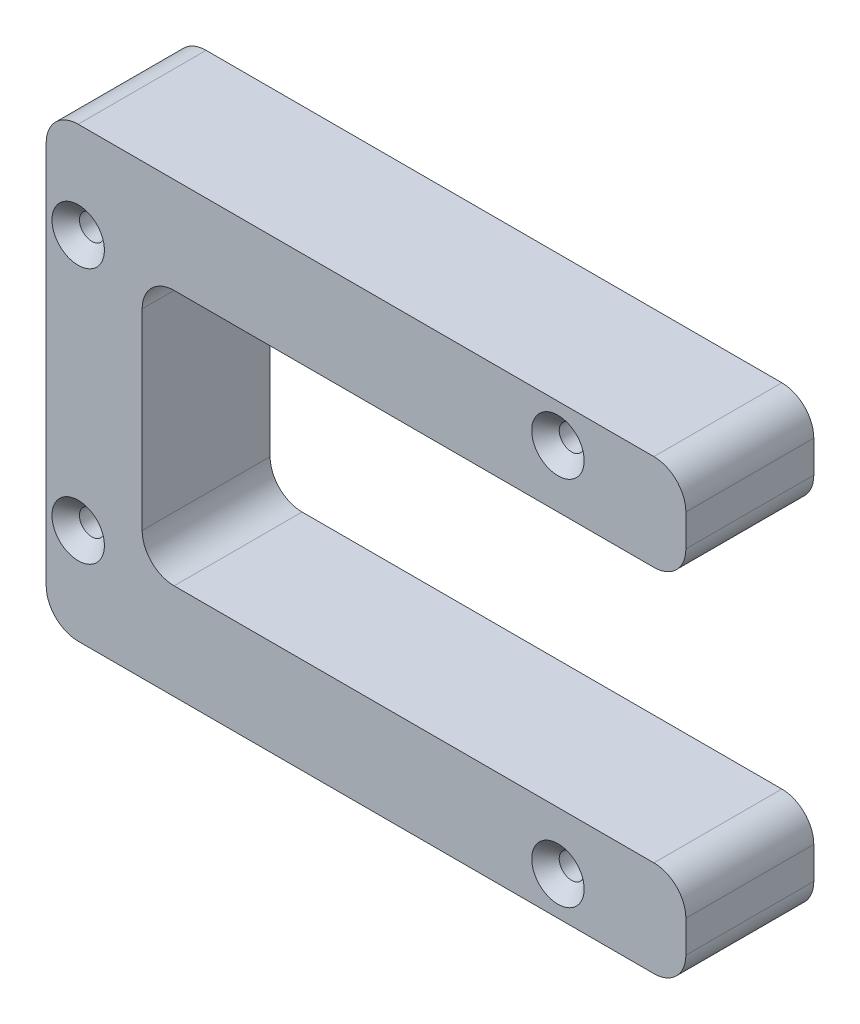
ISO-10303-21;
HEADER;
FILE_DESCRIPTION(('STEP AP214'),'2;1');
FILE_NAME('part.step','',(''),(''),'','','');
FILE_SCHEMA(('AUTOMOTIVE_DESIGN { 1 0 10303 214 1 1 1 1 }'));
ENDSEC;
DATA;
#1=APPLICATION_CONTEXT('core data for automotive mechanical design processes');
#2=APPLICATION_PROTOCOL_DEFINITION('international standard','automotive_design',2000,#1);
#3=PRODUCT_CONTEXT('',#1,'mechanical');
#4=PRODUCT('Part','Part','',(#3));
#5=PRODUCT_RELATED_PRODUCT_CATEGORY('part','',(#4));
#6=PRODUCT_DEFINITION_FORMATION('','',#4);
#7=PRODUCT_DEFINITION_CONTEXT('part definition',#1,'design');
#8=PRODUCT_DEFINITION('design','',#6,#7);
#9=PRODUCT_DEFINITION_SHAPE('','',#8);
#10=(LENGTH_UNIT() NAMED_UNIT(*) SI_UNIT(.MILLI.,.METRE.));
#11=(NAMED_UNIT(*) PLANE_ANGLE_UNIT() SI_UNIT($,.RADIAN.));
#12=(NAMED_UNIT(*) SI_UNIT($,.STERADIAN.) SOLID_ANGLE_UNIT());
#13=UNCERTAINTY_MEASURE_WITH_UNIT(LENGTH_MEASURE(1.E-05),#10,'distance_accuracy_value','');
#14=(GEOMETRIC_REPRESENTATION_CONTEXT(3) GLOBAL_UNCERTAINTY_ASSIGNED_CONTEXT((#13)) GLOBAL_UNIT_ASSIGNED_CONTEXT((#10,
#11,#12)) REPRESENTATION_CONTEXT('',''));
#15=CARTESIAN_POINT('',(0.,0.,0.));
#16=DIRECTION('',(0.,0.,1.));
#17=DIRECTION('',(1.,0.,0.));
#18=AXIS2_PLACEMENT_3D('',#15,#16,#17);
#19=CARTESIAN_POINT('',(50.,-35.,20.));
#20=DIRECTION('',(-1.,0.,0.));
#21=DIRECTION('',(0.,0.,1.));
#22=AXIS2_PLACEMENT_3D('',#19,#20,#21);
#23=PLANE('',#22);
#24=DIRECTION('',(0.,1.,0.));
#25=VECTOR('',#24,1.);
#26=CARTESIAN_POINT('',(50.,-35.,20.));
#27=LINE('',#26,#25);
#28=CARTESIAN_POINT('',(50.,-30.,20.));
#29=VERTEX_POINT('',#28);
#30=CARTESIAN_POINT('',(50.,-25.,20.));
#31=VERTEX_POINT('',#30);
#32=EDGE_CURVE('E173',#29,#31,#27,.T.);
#33=ORIENTED_EDGE('',*,*,#32,.F.);
#34=DIRECTION('',(0.,0.,-1.));
#35=VECTOR('',#34,1.);
#36=CARTESIAN_POINT('',(50.,-30.,20.));
#37=LINE('',#36,#35);
#38=CARTESIAN_POINT('',(50.,-30.,0.));
#39=VERTEX_POINT('',#38);
#40=EDGE_CURVE('E157',#29,#39,#37,.T.);
#41=ORIENTED_EDGE('',*,*,#40,.T.);
#42=DIRECTION('',(0.,1.,0.));
#43=VECTOR('',#42,1.);
#44=CARTESIAN_POINT('',(50.,-35.,0.));
#45=LINE('',#44,#43);
#46=CARTESIAN_POINT('',(50.,-25.,0.));
#47=VERTEX_POINT('',#46);
#48=EDGE_CURVE('E170',#39,#47,#45,.T.);
#49=ORIENTED_EDGE('',*,*,#48,.T.);
#50=DIRECTION('',(0.,0.,1.));
#51=VECTOR('',#50,1.);
#52=CARTESIAN_POINT('',(50.,-25.,20.));
#53=LINE('',#52,#51);
#54=EDGE_CURVE('E175',#47,#31,#53,.T.);
#55=ORIENTED_EDGE('',*,*,#54,.T.);
#56=EDGE_LOOP('',(#33,#41,#49,#55));
#57=FACE_BOUND('',#56,.T.);
#58=ADVANCED_FACE('F39',(#57),#23,.F.);
#59=CARTESIAN_POINT('',(50.,35.,20.));
#60=DIRECTION('',(0.,-1.,0.));
#61=DIRECTION('',(0.,0.,-1.));
#62=AXIS2_PLACEMENT_3D('',#59,#60,#61);
#63=PLANE('',#62);
#64=DIRECTION('',(-1.,0.,0.));
#65=VECTOR('',#64,1.);
#66=CARTESIAN_POINT('',(50.,35.,0.));
#67=LINE('',#66,#65);
#68=CARTESIAN_POINT('',(45.,35.,0.));
#69=VERTEX_POINT('',#68);
#70=CARTESIAN_POINT('',(-45.,35.,0.));
#71=VERTEX_POINT('',#70);
#72=EDGE_CURVE('E314',#69,#71,#67,.T.);
#73=ORIENTED_EDGE('',*,*,#72,.T.);
#74=DIRECTION('',(0.,0.,-1.));
#75=VECTOR('',#74,1.);
#76=CARTESIAN_POINT('',(-45.,35.,20.));
#77=LINE('',#76,#75);
#78=CARTESIAN_POINT('',(-45.,35.,20.));
#79=VERTEX_POINT('',#78);
#80=EDGE_CURVE('E221',#71,#79,#77,.F.);
#81=ORIENTED_EDGE('',*,*,#80,.T.);
#82=DIRECTION('',(-1.,0.,0.));
#83=VECTOR('',#82,1.);
#84=CARTESIAN_POINT('',(50.,35.,20.));
#85=LINE('',#84,#83);
#86=CARTESIAN_POINT('',(45.,35.,20.));
#87=VERTEX_POINT('',#86);
#88=EDGE_CURVE('E181',#87,#79,#85,.T.);
#89=ORIENTED_EDGE('',*,*,#88,.F.);
#90=DIRECTION('',(0.,0.,-1.));
#91=VECTOR('',#90,1.);
#92=CARTESIAN_POINT('',(45.,35.,20.));
#93=LINE('',#92,#91);
#94=EDGE_CURVE('E218',#87,#69,#93,.T.);
#95=ORIENTED_EDGE('',*,*,#94,.T.);
#96=EDGE_LOOP('',(#73,#81,#89,#95));
#97=FACE_BOUND('',#96,.T.);
#98=ADVANCED_FACE('F339',(#97),#63,.F.);
#99=CARTESIAN_POINT('',(-50.,-35.,20.));
#100=DIRECTION('',(1.,0.,0.));
#101=DIRECTION('',(0.,0.,-1.));
#102=AXIS2_PLACEMENT_3D('',#99,#100,#101);
#103=PLANE('',#102);
#104=DIRECTION('',(0.,-1.,0.));
#105=VECTOR('',#104,1.);
#106=CARTESIAN_POINT('',(-50.,-35.,0.));
#107=LINE('',#106,#105);
#108=CARTESIAN_POINT('',(-50.,30.,0.));
#109=VERTEX_POINT('',#108);
#110=CARTESIAN_POINT('',(-50.,-30.,0.));
#111=VERTEX_POINT('',#110);
#112=EDGE_CURVE('E323',#109,#111,#107,.T.);
#113=ORIENTED_EDGE('',*,*,#112,.T.);
#114=DIRECTION('',(0.,0.,-1.));
#115=VECTOR('',#114,1.);
#116=CARTESIAN_POINT('',(-50.,-30.,20.));
#117=LINE('',#116,#115);
#118=CARTESIAN_POINT('',(-50.,-30.,20.));
#119=VERTEX_POINT('',#118);
#120=EDGE_CURVE('E54',#111,#119,#117,.F.);
#121=ORIENTED_EDGE('',*,*,#120,.T.);
#122=DIRECTION('',(0.,-1.,0.));
#123=VECTOR('',#122,1.);
#124=CARTESIAN_POINT('',(-50.,-35.,20.));
#125=LINE('',#124,#123);
#126=CARTESIAN_POINT('',(-50.,30.,20.));
#127=VERTEX_POINT('',#126);
#128=EDGE_CURVE('E184',#127,#119,#125,.T.);
#129=ORIENTED_EDGE('',*,*,#128,.F.);
#130=DIRECTION('',(0.,0.,-1.));
#131=VECTOR('',#130,1.);
#132=CARTESIAN_POINT('',(-50.,30.,20.));
#133=LINE('',#132,#131);
#134=EDGE_CURVE('E214',#127,#109,#133,.T.);
#135=ORIENTED_EDGE('',*,*,#134,.T.);
#136=EDGE_LOOP('',(#113,#121,#129,#135));
#137=FACE_BOUND('',#136,.T.);
#138=ADVANCED_FACE('F333',(#137),#103,.F.);
#139=CARTESIAN_POINT('',(50.,-35.,20.));
#140=DIRECTION('',(0.,1.,0.));
#141=DIRECTION('',(0.,0.,1.));
#142=AXIS2_PLACEMENT_3D('',#139,#140,#141);
#143=PLANE('',#142);
#144=DIRECTION('',(1.,0.,0.));
#145=VECTOR('',#144,1.);
#146=CARTESIAN_POINT('',(50.,-35.,0.));
#147=LINE('',#146,#145);
#148=CARTESIAN_POINT('',(-45.,-35.,0.));
#149=VERTEX_POINT('',#148);
#150=CARTESIAN_POINT('',(45.,-35.,0.));
#151=VERTEX_POINT('',#150);
#152=EDGE_CURVE('E187',#149,#151,#147,.T.);
#153=ORIENTED_EDGE('',*,*,#152,.T.);
#154=DIRECTION('',(0.,0.,-1.));
#155=VECTOR('',#154,1.);
#156=CARTESIAN_POINT('',(45.,-35.,20.));
#157=LINE('',#156,#155);
#158=CARTESIAN_POINT('',(45.,-35.,20.));
#159=VERTEX_POINT('',#158);
#160=EDGE_CURVE('E158',#151,#159,#157,.F.);
#161=ORIENTED_EDGE('',*,*,#160,.T.);
#162=DIRECTION('',(1.,0.,0.));
#163=VECTOR('',#162,1.);
#164=CARTESIAN_POINT('',(50.,-35.,20.));
#165=LINE('',#164,#163);
#166=CARTESIAN_POINT('',(-45.,-35.,20.));
#167=VERTEX_POINT('',#166);
#168=EDGE_CURVE('E317',#167,#159,#165,.T.);
#169=ORIENTED_EDGE('',*,*,#168,.F.);
#170=DIRECTION('',(0.,0.,-1.));
#171=VECTOR('',#170,1.);
#172=CARTESIAN_POINT('',(-45.,-35.,20.));
#173=LINE('',#172,#171);
#174=EDGE_CURVE('E163',#167,#149,#173,.T.);
#175=ORIENTED_EDGE('',*,*,#174,.T.);
#176=EDGE_LOOP('',(#153,#161,#169,#175));
#177=FACE_BOUND('',#176,.T.);
#178=ADVANCED_FACE('F326',(#177),#143,.F.);
#179=CARTESIAN_POINT('',(50.,25.,0.));
#180=VERTEX_POINT('',#179);
#181=CARTESIAN_POINT('',(50.,30.,0.));
#182=VERTEX_POINT('',#181);
#183=EDGE_CURVE('E182',#180,#182,#45,.T.);
#184=ORIENTED_EDGE('',*,*,#183,.T.);
#185=DIRECTION('',(0.,0.,-1.));
#186=VECTOR('',#185,1.);
#187=CARTESIAN_POINT('',(50.,30.,20.));
#188=LINE('',#187,#186);
#189=CARTESIAN_POINT('',(50.,30.,20.));
#190=VERTEX_POINT('',#189);
#191=EDGE_CURVE('E225',#182,#190,#188,.F.);
#192=ORIENTED_EDGE('',*,*,#191,.T.);
#193=CARTESIAN_POINT('',(50.,25.,20.));
#194=VERTEX_POINT('',#193);
#195=EDGE_CURVE('E319',#194,#190,#27,.T.);
#196=ORIENTED_EDGE('',*,*,#195,.F.);
#197=DIRECTION('',(0.,0.,1.));
#198=VECTOR('',#197,1.);
#199=CARTESIAN_POINT('',(50.,25.,20.));
#200=LINE('',#199,#198);
#201=EDGE_CURVE('E223',#194,#180,#200,.F.);
#202=ORIENTED_EDGE('',*,*,#201,.T.);
#203=EDGE_LOOP('',(#184,#192,#196,#202));
#204=FACE_BOUND('',#203,.T.);
#205=ADVANCED_FACE('F349',(#204),#23,.F.);
#206=CARTESIAN_POINT('',(0.,0.,20.));
#207=DIRECTION('',(0.,0.,-1.));
#208=DIRECTION('',(-1.,0.,0.));
#209=AXIS2_PLACEMENT_3D('',#206,#207,#208);
#210=PLANE('',#209);
#211=CARTESIAN_POINT('',(-45.,20.,20.));
#212=DIRECTION('',(0.,0.,1.));
#213=DIRECTION('',(1.,0.,0.));
#214=AXIS2_PLACEMENT_3D('',#211,#212,#213);
#215=CIRCLE('',#214,4.1);
#216=CARTESIAN_POINT('',(-40.9,20.,20.));
#217=VERTEX_POINT('',#216);
#218=EDGE_CURVE('E271',#217,#217,#215,.T.);
#219=ORIENTED_EDGE('',*,*,#218,.F.);
#220=EDGE_LOOP('',(#219));
#221=FACE_BOUND('',#220,.T.);
#222=CARTESIAN_POINT('',(30.,29.,20.));
#223=DIRECTION('',(0.,0.,1.));
#224=DIRECTION('',(1.,0.,0.));
#225=AXIS2_PLACEMENT_3D('',#222,#223,#224);
#226=CIRCLE('',#225,4.1);
#227=CARTESIAN_POINT('',(34.1,29.,20.));
#228=VERTEX_POINT('',#227);
#229=EDGE_CURVE('E288',#228,#228,#226,.T.);
#230=ORIENTED_EDGE('',*,*,#229,.F.);
#231=EDGE_LOOP('',(#230));
#232=FACE_BOUND('',#231,.T.);
#233=CARTESIAN_POINT('',(-45.,-20.,20.));
#234=DIRECTION('',(0.,0.,1.));
#235=DIRECTION('',(1.,0.,0.));
#236=AXIS2_PLACEMENT_3D('',#233,#234,#235);
#237=CIRCLE('',#236,4.1);
#238=CARTESIAN_POINT('',(-40.9,-20.,20.));
#239=VERTEX_POINT('',#238);
#240=EDGE_CURVE('E297',#239,#239,#237,.T.);
#241=ORIENTED_EDGE('',*,*,#240,.F.);
#242=EDGE_LOOP('',(#241));
#243=FACE_BOUND('',#242,.T.);
#244=CARTESIAN_POINT('',(30.,-29.,20.));
#245=DIRECTION('',(0.,0.,1.));
#246=DIRECTION('',(1.,0.,0.));
#247=AXIS2_PLACEMENT_3D('',#244,#245,#246);
#248=CIRCLE('',#247,4.1);
#249=CARTESIAN_POINT('',(34.1,-29.,20.));
#250=VERTEX_POINT('',#249);
#251=EDGE_CURVE('E306',#250,#250,#248,.T.);
#252=ORIENTED_EDGE('',*,*,#251,.F.);
#253=EDGE_LOOP('',(#252));
#254=FACE_BOUND('',#253,.T.);
#255=ORIENTED_EDGE('',*,*,#168,.T.);
#256=CARTESIAN_POINT('',(45.,-30.,20.));
#257=DIRECTION('',(0.,0.,-1.));
#258=DIRECTION('',(-1.,0.,0.));
#259=AXIS2_PLACEMENT_3D('',#256,#257,#258);
#260=CIRCLE('',#259,5.);
#261=EDGE_CURVE('E212',#159,#29,#260,.F.);
#262=ORIENTED_EDGE('',*,*,#261,.T.);
#263=ORIENTED_EDGE('',*,*,#32,.T.);
#264=CARTESIAN_POINT('',(45.,-25.,20.));
#265=DIRECTION('',(0.,0.,-1.));
#266=DIRECTION('',(-1.,0.,0.));
#267=AXIS2_PLACEMENT_3D('',#264,#265,#266);
#268=CIRCLE('',#267,5.);
#269=CARTESIAN_POINT('',(45.,-20.,20.));
#270=VERTEX_POINT('',#269);
#271=EDGE_CURVE('E203',#31,#270,#268,.F.);
#272=ORIENTED_EDGE('',*,*,#271,.T.);
#273=DIRECTION('',(1.,0.,0.));
#274=VECTOR('',#273,1.);
#275=CARTESIAN_POINT('',(50.,-20.,20.));
#276=LINE('',#275,#274);
#277=CARTESIAN_POINT('',(-30.,-20.,20.));
#278=VERTEX_POINT('',#277);
#279=EDGE_CURVE('E252',#278,#270,#276,.T.);
#280=ORIENTED_EDGE('',*,*,#279,.F.);
#281=CARTESIAN_POINT('',(-30.,-15.,20.));
#282=DIRECTION('',(0.,0.,-1.));
#283=DIRECTION('',(-1.,0.,0.));
#284=AXIS2_PLACEMENT_3D('',#281,#282,#283);
#285=CIRCLE('',#284,5.);
#286=CARTESIAN_POINT('',(-35.,-15.,20.));
#287=VERTEX_POINT('',#286);
#288=EDGE_CURVE('E47',#278,#287,#285,.T.);
#289=ORIENTED_EDGE('',*,*,#288,.T.);
#290=DIRECTION('',(0.,-1.,0.));
#291=VECTOR('',#290,1.);
#292=CARTESIAN_POINT('',(-35.,20.,20.));
#293=LINE('',#292,#291);
#294=CARTESIAN_POINT('',(-35.,15.,20.));
#295=VERTEX_POINT('',#294);
#296=EDGE_CURVE('E250',#295,#287,#293,.T.);
#297=ORIENTED_EDGE('',*,*,#296,.F.);
#298=CARTESIAN_POINT('',(-30.,15.,20.));
#299=DIRECTION('',(0.,0.,-1.));
#300=DIRECTION('',(-1.,0.,0.));
#301=AXIS2_PLACEMENT_3D('',#298,#299,#300);
#302=CIRCLE('',#301,5.);
#303=CARTESIAN_POINT('',(-30.,20.,20.));
#304=VERTEX_POINT('',#303);
#305=EDGE_CURVE('E242',#295,#304,#302,.T.);
#306=ORIENTED_EDGE('',*,*,#305,.T.);
#307=DIRECTION('',(-1.,0.,0.));
#308=VECTOR('',#307,1.);
#309=CARTESIAN_POINT('',(50.,20.,20.));
#310=LINE('',#309,#308);
#311=CARTESIAN_POINT('',(45.,20.,20.));
#312=VERTEX_POINT('',#311);
#313=EDGE_CURVE('E261',#312,#304,#310,.T.);
#314=ORIENTED_EDGE('',*,*,#313,.F.);
#315=CARTESIAN_POINT('',(45.,25.,20.));
#316=DIRECTION('',(0.,0.,-1.));
#317=DIRECTION('',(-1.,0.,0.));
#318=AXIS2_PLACEMENT_3D('',#315,#316,#317);
#319=CIRCLE('',#318,5.);
#320=EDGE_CURVE('E205',#312,#194,#319,.F.);
#321=ORIENTED_EDGE('',*,*,#320,.T.);
#322=ORIENTED_EDGE('',*,*,#195,.T.);
#323=CARTESIAN_POINT('',(45.,30.,20.));
#324=DIRECTION('',(0.,0.,-1.));
#325=DIRECTION('',(-1.,0.,0.));
#326=AXIS2_PLACEMENT_3D('',#323,#324,#325);
#327=CIRCLE('',#326,5.);
#328=EDGE_CURVE('E207',#190,#87,#327,.F.);
#329=ORIENTED_EDGE('',*,*,#328,.T.);
#330=ORIENTED_EDGE('',*,*,#88,.T.);
#331=CARTESIAN_POINT('',(-45.,30.,20.));
#332=DIRECTION('',(0.,0.,-1.));
#333=DIRECTION('',(-1.,0.,0.));
#334=AXIS2_PLACEMENT_3D('',#331,#332,#333);
#335=CIRCLE('',#334,5.);
#336=EDGE_CURVE('E61',#79,#127,#335,.F.);
#337=ORIENTED_EDGE('',*,*,#336,.T.);
#338=ORIENTED_EDGE('',*,*,#128,.T.);
#339=CARTESIAN_POINT('',(-45.,-30.,20.));
#340=DIRECTION('',(0.,0.,-1.));
#341=DIRECTION('',(-1.,0.,0.));
#342=AXIS2_PLACEMENT_3D('',#339,#340,#341);
#343=CIRCLE('',#342,5.);
#344=EDGE_CURVE('E210',#119,#167,#343,.F.);
#345=ORIENTED_EDGE('',*,*,#344,.T.);
#346=EDGE_LOOP('',(#255,#262,#263,#272,#280,#289,#297,#306,#314,#321,#322,#329,#330,#337,#338,#345));
#347=FACE_BOUND('',#346,.T.);
#348=ADVANCED_FACE('F249',(#221,#232,#243,#254,#347),#210,.F.);
#349=CARTESIAN_POINT('',(0.,0.,0.));
#350=DIRECTION('',(0.,0.,-1.));
#351=DIRECTION('',(-1.,0.,0.));
#352=AXIS2_PLACEMENT_3D('',#349,#350,#351);
#353=PLANE('',#352);
#354=ORIENTED_EDGE('',*,*,#48,.F.);
#355=CARTESIAN_POINT('',(45.,-30.,0.));
#356=DIRECTION('',(0.,0.,-1.));
#357=DIRECTION('',(-1.,0.,0.));
#358=AXIS2_PLACEMENT_3D('',#355,#356,#357);
#359=CIRCLE('',#358,5.);
#360=EDGE_CURVE('E153',#39,#151,#359,.T.);
#361=ORIENTED_EDGE('',*,*,#360,.T.);
#362=ORIENTED_EDGE('',*,*,#152,.F.);
#363=CARTESIAN_POINT('',(-45.,-30.,0.));
#364=DIRECTION('',(0.,0.,-1.));
#365=DIRECTION('',(-1.,0.,0.));
#366=AXIS2_PLACEMENT_3D('',#363,#364,#365);
#367=CIRCLE('',#366,5.);
#368=EDGE_CURVE('E164',#149,#111,#367,.T.);
#369=ORIENTED_EDGE('',*,*,#368,.T.);
#370=ORIENTED_EDGE('',*,*,#112,.F.);
#371=CARTESIAN_POINT('',(-45.,30.,0.));
#372=DIRECTION('',(0.,0.,-1.));
#373=DIRECTION('',(-1.,0.,0.));
#374=AXIS2_PLACEMENT_3D('',#371,#372,#373);
#375=CIRCLE('',#374,5.);
#376=EDGE_CURVE('E197',#109,#71,#375,.T.);
#377=ORIENTED_EDGE('',*,*,#376,.T.);
#378=ORIENTED_EDGE('',*,*,#72,.F.);
#379=CARTESIAN_POINT('',(45.,30.,0.));
#380=DIRECTION('',(0.,0.,-1.));
#381=DIRECTION('',(-1.,0.,0.));
#382=AXIS2_PLACEMENT_3D('',#379,#380,#381);
#383=CIRCLE('',#382,5.);
#384=EDGE_CURVE('E195',#69,#182,#383,.T.);
#385=ORIENTED_EDGE('',*,*,#384,.T.);
#386=ORIENTED_EDGE('',*,*,#183,.F.);
#387=CARTESIAN_POINT('',(45.,25.,0.));
#388=DIRECTION('',(0.,0.,-1.));
#389=DIRECTION('',(-1.,0.,0.));
#390=AXIS2_PLACEMENT_3D('',#387,#388,#389);
#391=CIRCLE('',#390,5.);
#392=CARTESIAN_POINT('',(45.,20.,0.));
#393=VERTEX_POINT('',#392);
#394=EDGE_CURVE('E193',#180,#393,#391,.T.);
#395=ORIENTED_EDGE('',*,*,#394,.T.);
#396=DIRECTION('',(-1.,0.,0.));
#397=VECTOR('',#396,1.);
#398=CARTESIAN_POINT('',(50.,20.,0.));
#399=LINE('',#398,#397);
#400=CARTESIAN_POINT('',(-30.,20.,0.));
#401=VERTEX_POINT('',#400);
#402=EDGE_CURVE('E276',#393,#401,#399,.T.);
#403=ORIENTED_EDGE('',*,*,#402,.T.);
#404=CARTESIAN_POINT('',(-30.,15.,0.));
#405=DIRECTION('',(0.,0.,-1.));
#406=DIRECTION('',(-1.,0.,0.));
#407=AXIS2_PLACEMENT_3D('',#404,#405,#406);
#408=CIRCLE('',#407,5.);
#409=CARTESIAN_POINT('',(-35.,15.,0.));
#410=VERTEX_POINT('',#409);
#411=EDGE_CURVE('E244',#401,#410,#408,.F.);
#412=ORIENTED_EDGE('',*,*,#411,.T.);
#413=DIRECTION('',(0.,-1.,0.));
#414=VECTOR('',#413,1.);
#415=CARTESIAN_POINT('',(-35.,20.,0.));
#416=LINE('',#415,#414);
#417=CARTESIAN_POINT('',(-35.,-15.,0.));
#418=VERTEX_POINT('',#417);
#419=EDGE_CURVE('E267',#410,#418,#416,.T.);
#420=ORIENTED_EDGE('',*,*,#419,.T.);
#421=CARTESIAN_POINT('',(-30.,-15.,0.));
#422=DIRECTION('',(0.,0.,-1.));
#423=DIRECTION('',(-1.,0.,0.));
#424=AXIS2_PLACEMENT_3D('',#421,#422,#423);
#425=CIRCLE('',#424,5.);
#426=CARTESIAN_POINT('',(-30.,-20.,0.));
#427=VERTEX_POINT('',#426);
#428=EDGE_CURVE('E11',#418,#427,#425,.F.);
#429=ORIENTED_EDGE('',*,*,#428,.T.);
#430=DIRECTION('',(1.,0.,0.));
#431=VECTOR('',#430,1.);
#432=CARTESIAN_POINT('',(50.,-20.,0.));
#433=LINE('',#432,#431);
#434=CARTESIAN_POINT('',(45.,-20.,0.));
#435=VERTEX_POINT('',#434);
#436=EDGE_CURVE('E266',#427,#435,#433,.T.);
#437=ORIENTED_EDGE('',*,*,#436,.T.);
#438=CARTESIAN_POINT('',(45.,-25.,0.));
#439=DIRECTION('',(0.,0.,-1.));
#440=DIRECTION('',(-1.,0.,0.));
#441=AXIS2_PLACEMENT_3D('',#438,#439,#440);
#442=CIRCLE('',#441,5.);
#443=EDGE_CURVE('E174',#435,#47,#442,.T.);
#444=ORIENTED_EDGE('',*,*,#443,.T.);
#445=EDGE_LOOP('',(#354,#361,#362,#369,#370,#377,#378,#385,#386,#395,#403,#412,#420,#429,#437,#444));
#446=FACE_BOUND('',#445,.T.);
#447=CARTESIAN_POINT('',(-45.,20.,0.));
#448=DIRECTION('',(0.,0.,1.));
#449=DIRECTION('',(1.,0.,0.));
#450=AXIS2_PLACEMENT_3D('',#447,#448,#449);
#451=CIRCLE('',#450,1.94999999999999);
#452=CARTESIAN_POINT('',(-43.05,20.,0.));
#453=VERTEX_POINT('',#452);
#454=EDGE_CURVE('E285',#453,#453,#451,.T.);
#455=ORIENTED_EDGE('',*,*,#454,.T.);
#456=EDGE_LOOP('',(#455));
#457=FACE_BOUND('',#456,.T.);
#458=CARTESIAN_POINT('',(30.,29.,0.));
#459=DIRECTION('',(0.,0.,1.));
#460=DIRECTION('',(1.,0.,0.));
#461=AXIS2_PLACEMENT_3D('',#458,#459,#460);
#462=CIRCLE('',#461,1.94999999999999);
#463=CARTESIAN_POINT('',(31.95,29.,0.));
#464=VERTEX_POINT('',#463);
#465=EDGE_CURVE('E294',#464,#464,#462,.T.);
#466=ORIENTED_EDGE('',*,*,#465,.T.);
#467=EDGE_LOOP('',(#466));
#468=FACE_BOUND('',#467,.T.);
#469=CARTESIAN_POINT('',(-45.,-20.,0.));
#470=DIRECTION('',(0.,0.,1.));
#471=DIRECTION('',(1.,0.,0.));
#472=AXIS2_PLACEMENT_3D('',#469,#470,#471);
#473=CIRCLE('',#472,1.94999999999999);
#474=CARTESIAN_POINT('',(-43.05,-20.,0.));
#475=VERTEX_POINT('',#474);
#476=EDGE_CURVE('E303',#475,#475,#473,.T.);
#477=ORIENTED_EDGE('',*,*,#476,.T.);
#478=EDGE_LOOP('',(#477));
#479=FACE_BOUND('',#478,.T.);
#480=CARTESIAN_POINT('',(30.,-29.,0.));
#481=DIRECTION('',(0.,0.,1.));
#482=DIRECTION('',(1.,0.,0.));
#483=AXIS2_PLACEMENT_3D('',#480,#481,#482);
#484=CIRCLE('',#483,1.94999999999999);
#485=CARTESIAN_POINT('',(31.95,-29.,0.));
#486=VERTEX_POINT('',#485);
#487=EDGE_CURVE('E312',#486,#486,#484,.T.);
#488=ORIENTED_EDGE('',*,*,#487,.T.);
#489=EDGE_LOOP('',(#488));
#490=FACE_BOUND('',#489,.T.);
#491=ADVANCED_FACE('F177',(#446,#457,#468,#479,#490),#353,.T.);
#492=CARTESIAN_POINT('',(30.,-29.,20.));
#493=DIRECTION('',(0.,0.,1.));
#494=DIRECTION('',(1.,0.,0.));
#495=AXIS2_PLACEMENT_3D('',#492,#493,#494);
#496=CYLINDRICAL_SURFACE('',#495,1.94999999999999);
#497=ORIENTED_EDGE('',*,*,#487,.F.);
#498=EDGE_LOOP('',(#497));
#499=FACE_BOUND('',#498,.T.);
#500=CARTESIAN_POINT('',(30.,-29.,17.85));
#501=DIRECTION('',(0.,0.,1.));
#502=DIRECTION('',(1.,0.,0.));
#503=AXIS2_PLACEMENT_3D('',#500,#501,#502);
#504=CIRCLE('',#503,1.94999999999999);
#505=CARTESIAN_POINT('',(31.95,-29.,17.85));
#506=VERTEX_POINT('',#505);
#507=EDGE_CURVE('E309',#506,#506,#504,.T.);
#508=ORIENTED_EDGE('',*,*,#507,.T.);
#509=EDGE_LOOP('',(#508));
#510=FACE_BOUND('',#509,.T.);
#511=ADVANCED_FACE('F529',(#499,#510),#496,.F.);
#512=CARTESIAN_POINT('',(30.,-29.,20.));
#513=DIRECTION('',(0.,0.,1.));
#514=DIRECTION('',(1.,0.,0.));
#515=AXIS2_PLACEMENT_3D('',#512,#513,#514);
#516=CONICAL_SURFACE('',#515,4.1,0.785398163397451);
#517=ORIENTED_EDGE('',*,*,#507,.F.);
#518=EDGE_LOOP('',(#517));
#519=FACE_BOUND('',#518,.T.);
#520=ORIENTED_EDGE('',*,*,#251,.T.);
#521=EDGE_LOOP('',(#520));
#522=FACE_BOUND('',#521,.T.);
#523=ADVANCED_FACE('F520',(#519,#522),#516,.F.);
#524=CARTESIAN_POINT('',(-45.,-20.,20.));
#525=DIRECTION('',(0.,0.,1.));
#526=DIRECTION('',(1.,0.,0.));
#527=AXIS2_PLACEMENT_3D('',#524,#525,#526);
#528=CYLINDRICAL_SURFACE('',#527,1.94999999999999);
#529=ORIENTED_EDGE('',*,*,#476,.F.);
#530=EDGE_LOOP('',(#529));
#531=FACE_BOUND('',#530,.T.);
#532=CARTESIAN_POINT('',(-45.,-20.,17.85));
#533=DIRECTION('',(0.,0.,1.));
#534=DIRECTION('',(1.,0.,0.));
#535=AXIS2_PLACEMENT_3D('',#532,#533,#534);
#536=CIRCLE('',#535,1.94999999999999);
#537=CARTESIAN_POINT('',(-43.05,-20.,17.85));
#538=VERTEX_POINT('',#537);
#539=EDGE_CURVE('E300',#538,#538,#536,.T.);
#540=ORIENTED_EDGE('',*,*,#539,.T.);
#541=EDGE_LOOP('',(#540));
#542=FACE_BOUND('',#541,.T.);
#543=ADVANCED_FACE('F511',(#531,#542),#528,.F.);
#544=CARTESIAN_POINT('',(-45.,-20.,20.));
#545=DIRECTION('',(0.,0.,1.));
#546=DIRECTION('',(1.,0.,0.));
#547=AXIS2_PLACEMENT_3D('',#544,#545,#546);
#548=CONICAL_SURFACE('',#547,4.1,0.785398163397451);
#549=ORIENTED_EDGE('',*,*,#539,.F.);
#550=EDGE_LOOP('',(#549));
#551=FACE_BOUND('',#550,.T.);
#552=ORIENTED_EDGE('',*,*,#240,.T.);
#553=EDGE_LOOP('',(#552));
#554=FACE_BOUND('',#553,.T.);
#555=ADVANCED_FACE('F502',(#551,#554),#548,.F.);
#556=CARTESIAN_POINT('',(30.,29.,20.));
#557=DIRECTION('',(0.,0.,1.));
#558=DIRECTION('',(1.,0.,0.));
#559=AXIS2_PLACEMENT_3D('',#556,#557,#558);
#560=CYLINDRICAL_SURFACE('',#559,1.94999999999999);
#561=ORIENTED_EDGE('',*,*,#465,.F.);
#562=EDGE_LOOP('',(#561));
#563=FACE_BOUND('',#562,.T.);
#564=CARTESIAN_POINT('',(30.,29.,17.85));
#565=DIRECTION('',(0.,0.,1.));
#566=DIRECTION('',(1.,0.,0.));
#567=AXIS2_PLACEMENT_3D('',#564,#565,#566);
#568=CIRCLE('',#567,1.94999999999999);
#569=CARTESIAN_POINT('',(31.95,29.,17.85));
#570=VERTEX_POINT('',#569);
#571=EDGE_CURVE('E291',#570,#570,#568,.T.);
#572=ORIENTED_EDGE('',*,*,#571,.T.);
#573=EDGE_LOOP('',(#572));
#574=FACE_BOUND('',#573,.T.);
#575=ADVANCED_FACE('F493',(#563,#574),#560,.F.);
#576=CARTESIAN_POINT('',(30.,29.,20.));
#577=DIRECTION('',(0.,0.,1.));
#578=DIRECTION('',(1.,0.,0.));
#579=AXIS2_PLACEMENT_3D('',#576,#577,#578);
#580=CONICAL_SURFACE('',#579,4.1,0.785398163397451);
#581=ORIENTED_EDGE('',*,*,#571,.F.);
#582=EDGE_LOOP('',(#581));
#583=FACE_BOUND('',#582,.T.);
#584=ORIENTED_EDGE('',*,*,#229,.T.);
#585=EDGE_LOOP('',(#584));
#586=FACE_BOUND('',#585,.T.);
#587=ADVANCED_FACE('F484',(#583,#586),#580,.F.);
#588=CARTESIAN_POINT('',(-45.,20.,20.));
#589=DIRECTION('',(0.,0.,1.));
#590=DIRECTION('',(1.,0.,0.));
#591=AXIS2_PLACEMENT_3D('',#588,#589,#590);
#592=CYLINDRICAL_SURFACE('',#591,1.94999999999999);
#593=ORIENTED_EDGE('',*,*,#454,.F.);
#594=EDGE_LOOP('',(#593));
#595=FACE_BOUND('',#594,.T.);
#596=CARTESIAN_POINT('',(-45.,20.,17.85));
#597=DIRECTION('',(0.,0.,1.));
#598=DIRECTION('',(1.,0.,0.));
#599=AXIS2_PLACEMENT_3D('',#596,#597,#598);
#600=CIRCLE('',#599,1.94999999999999);
#601=CARTESIAN_POINT('',(-43.05,20.,17.85));
#602=VERTEX_POINT('',#601);
#603=EDGE_CURVE('E274',#602,#602,#600,.T.);
#604=ORIENTED_EDGE('',*,*,#603,.T.);
#605=EDGE_LOOP('',(#604));
#606=FACE_BOUND('',#605,.T.);
#607=ADVANCED_FACE('F475',(#595,#606),#592,.F.);
#608=CARTESIAN_POINT('',(-45.,20.,20.));
#609=DIRECTION('',(0.,0.,1.));
#610=DIRECTION('',(1.,0.,0.));
#611=AXIS2_PLACEMENT_3D('',#608,#609,#610);
#612=CONICAL_SURFACE('',#611,4.1,0.785398163397451);
#613=ORIENTED_EDGE('',*,*,#603,.F.);
#614=EDGE_LOOP('',(#613));
#615=FACE_BOUND('',#614,.T.);
#616=ORIENTED_EDGE('',*,*,#218,.T.);
#617=EDGE_LOOP('',(#616));
#618=FACE_BOUND('',#617,.T.);
#619=ADVANCED_FACE('F463',(#615,#618),#612,.F.);
#620=CARTESIAN_POINT('',(50.,-20.,0.));
#621=DIRECTION('',(0.,-1.,0.));
#622=DIRECTION('',(1.,0.,0.));
#623=AXIS2_PLACEMENT_3D('',#620,#621,#622);
#624=PLANE('',#623);
#625=ORIENTED_EDGE('',*,*,#436,.F.);
#626=DIRECTION('',(0.,0.,1.));
#627=VECTOR('',#626,1.);
#628=CARTESIAN_POINT('',(-30.,-20.,20.));
#629=LINE('',#628,#627);
#630=EDGE_CURVE('E239',#427,#278,#629,.T.);
#631=ORIENTED_EDGE('',*,*,#630,.T.);
#632=ORIENTED_EDGE('',*,*,#279,.T.);
#633=DIRECTION('',(0.,0.,1.));
#634=VECTOR('',#633,1.);
#635=CARTESIAN_POINT('',(45.,-20.,0.));
#636=LINE('',#635,#634);
#637=EDGE_CURVE('E237',#270,#435,#636,.F.);
#638=ORIENTED_EDGE('',*,*,#637,.T.);
#639=EDGE_LOOP('',(#625,#631,#632,#638));
#640=FACE_BOUND('',#639,.T.);
#641=ADVANCED_FACE('F269',(#640),#624,.F.);
#642=CARTESIAN_POINT('',(-35.,20.,0.));
#643=DIRECTION('',(-1.,0.,0.));
#644=DIRECTION('',(0.,0.,1.));
#645=AXIS2_PLACEMENT_3D('',#642,#643,#644);
#646=PLANE('',#645);
#647=ORIENTED_EDGE('',*,*,#419,.F.);
#648=DIRECTION('',(0.,0.,1.));
#649=VECTOR('',#648,1.);
#650=CARTESIAN_POINT('',(-35.,15.,20.));
#651=LINE('',#650,#649);
#652=EDGE_CURVE('E234',#410,#295,#651,.T.);
#653=ORIENTED_EDGE('',*,*,#652,.T.);
#654=ORIENTED_EDGE('',*,*,#296,.T.);
#655=DIRECTION('',(0.,0.,1.));
#656=VECTOR('',#655,1.);
#657=CARTESIAN_POINT('',(-35.,-15.,0.));
#658=LINE('',#657,#656);
#659=EDGE_CURVE('E232',#287,#418,#658,.F.);
#660=ORIENTED_EDGE('',*,*,#659,.T.);
#661=EDGE_LOOP('',(#647,#653,#654,#660));
#662=FACE_BOUND('',#661,.T.);
#663=ADVANCED_FACE('F258',(#662),#646,.F.);
#664=CARTESIAN_POINT('',(50.,20.,0.));
#665=DIRECTION('',(0.,1.,0.));
#666=DIRECTION('',(-1.,0.,0.));
#667=AXIS2_PLACEMENT_3D('',#664,#665,#666);
#668=PLANE('',#667);
#669=ORIENTED_EDGE('',*,*,#402,.F.);
#670=DIRECTION('',(0.,0.,1.));
#671=VECTOR('',#670,1.);
#672=CARTESIAN_POINT('',(45.,20.,0.));
#673=LINE('',#672,#671);
#674=EDGE_CURVE('E229',#393,#312,#673,.T.);
#675=ORIENTED_EDGE('',*,*,#674,.T.);
#676=ORIENTED_EDGE('',*,*,#313,.T.);
#677=DIRECTION('',(0.,0.,1.));
#678=VECTOR('',#677,1.);
#679=CARTESIAN_POINT('',(-30.,20.,0.));
#680=LINE('',#679,#678);
#681=EDGE_CURVE('E227',#304,#401,#680,.F.);
#682=ORIENTED_EDGE('',*,*,#681,.T.);
#683=EDGE_LOOP('',(#669,#675,#676,#682));
#684=FACE_BOUND('',#683,.T.);
#685=ADVANCED_FACE('F359',(#684),#668,.F.);
#686=CARTESIAN_POINT('',(45.,-30.,20.));
#687=DIRECTION('',(0.,0.,-1.));
#688=DIRECTION('',(-1.,0.,0.));
#689=AXIS2_PLACEMENT_3D('',#686,#687,#688);
#690=CYLINDRICAL_SURFACE('',#689,5.);
#691=ORIENTED_EDGE('',*,*,#261,.F.);
#692=ORIENTED_EDGE('',*,*,#160,.F.);
#693=ORIENTED_EDGE('',*,*,#360,.F.);
#694=ORIENTED_EDGE('',*,*,#40,.F.);
#695=EDGE_LOOP('',(#691,#692,#693,#694));
#696=FACE_BOUND('',#695,.T.);
#697=ADVANCED_FACE('F156',(#696),#690,.T.);
#698=CARTESIAN_POINT('',(-45.,-30.,20.));
#699=DIRECTION('',(0.,0.,-1.));
#700=DIRECTION('',(-1.,0.,0.));
#701=AXIS2_PLACEMENT_3D('',#698,#699,#700);
#702=CYLINDRICAL_SURFACE('',#701,5.);
#703=ORIENTED_EDGE('',*,*,#344,.F.);
#704=ORIENTED_EDGE('',*,*,#120,.F.);
#705=ORIENTED_EDGE('',*,*,#368,.F.);
#706=ORIENTED_EDGE('',*,*,#174,.F.);
#707=EDGE_LOOP('',(#703,#704,#705,#706));
#708=FACE_BOUND('',#707,.T.);
#709=ADVANCED_FACE('F331',(#708),#702,.T.);
#710=CARTESIAN_POINT('',(-45.,30.,20.));
#711=DIRECTION('',(0.,0.,-1.));
#712=DIRECTION('',(-1.,0.,0.));
#713=AXIS2_PLACEMENT_3D('',#710,#711,#712);
#714=CYLINDRICAL_SURFACE('',#713,5.);
#715=ORIENTED_EDGE('',*,*,#336,.F.);
#716=ORIENTED_EDGE('',*,*,#80,.F.);
#717=ORIENTED_EDGE('',*,*,#376,.F.);
#718=ORIENTED_EDGE('',*,*,#134,.F.);
#719=EDGE_LOOP('',(#715,#716,#717,#718));
#720=FACE_BOUND('',#719,.T.);
#721=ADVANCED_FACE('F335',(#720),#714,.T.);
#722=CARTESIAN_POINT('',(45.,30.,20.));
#723=DIRECTION('',(0.,0.,-1.));
#724=DIRECTION('',(-1.,0.,0.));
#725=AXIS2_PLACEMENT_3D('',#722,#723,#724);
#726=CYLINDRICAL_SURFACE('',#725,5.);
#727=ORIENTED_EDGE('',*,*,#328,.F.);
#728=ORIENTED_EDGE('',*,*,#191,.F.);
#729=ORIENTED_EDGE('',*,*,#384,.F.);
#730=ORIENTED_EDGE('',*,*,#94,.F.);
#731=EDGE_LOOP('',(#727,#728,#729,#730));
#732=FACE_BOUND('',#731,.T.);
#733=ADVANCED_FACE('F344',(#732),#726,.T.);
#734=CARTESIAN_POINT('',(45.,25.,0.));
#735=DIRECTION('',(0.,0.,1.));
#736=DIRECTION('',(1.,0.,0.));
#737=AXIS2_PLACEMENT_3D('',#734,#735,#736);
#738=CYLINDRICAL_SURFACE('',#737,5.);
#739=ORIENTED_EDGE('',*,*,#394,.F.);
#740=ORIENTED_EDGE('',*,*,#201,.F.);
#741=ORIENTED_EDGE('',*,*,#320,.F.);
#742=ORIENTED_EDGE('',*,*,#674,.F.);
#743=EDGE_LOOP('',(#739,#740,#741,#742));
#744=FACE_BOUND('',#743,.T.);
#745=ADVANCED_FACE('F353',(#744),#738,.T.);
#746=CARTESIAN_POINT('',(-30.,15.,0.));
#747=DIRECTION('',(0.,0.,-1.));
#748=DIRECTION('',(-1.,0.,0.));
#749=AXIS2_PLACEMENT_3D('',#746,#747,#748);
#750=CYLINDRICAL_SURFACE('',#749,5.);
#751=ORIENTED_EDGE('',*,*,#411,.F.);
#752=ORIENTED_EDGE('',*,*,#681,.F.);
#753=ORIENTED_EDGE('',*,*,#305,.F.);
#754=ORIENTED_EDGE('',*,*,#652,.F.);
#755=EDGE_LOOP('',(#751,#752,#753,#754));
#756=FACE_BOUND('',#755,.T.);
#757=ADVANCED_FACE('F363',(#756),#750,.F.);
#758=CARTESIAN_POINT('',(-30.,-15.,0.));
#759=DIRECTION('',(0.,0.,-1.));
#760=DIRECTION('',(-1.,0.,0.));
#761=AXIS2_PLACEMENT_3D('',#758,#759,#760);
#762=CYLINDRICAL_SURFACE('',#761,5.);
#763=ORIENTED_EDGE('',*,*,#428,.F.);
#764=ORIENTED_EDGE('',*,*,#659,.F.);
#765=ORIENTED_EDGE('',*,*,#288,.F.);
#766=ORIENTED_EDGE('',*,*,#630,.F.);
#767=EDGE_LOOP('',(#763,#764,#765,#766));
#768=FACE_BOUND('',#767,.T.);
#769=ADVANCED_FACE('F264',(#768),#762,.F.);
#770=CARTESIAN_POINT('',(45.,-25.,20.));
#771=DIRECTION('',(0.,0.,1.));
#772=DIRECTION('',(1.,0.,0.));
#773=AXIS2_PLACEMENT_3D('',#770,#771,#772);
#774=CYLINDRICAL_SURFACE('',#773,5.);
#775=ORIENTED_EDGE('',*,*,#443,.F.);
#776=ORIENTED_EDGE('',*,*,#637,.F.);
#777=ORIENTED_EDGE('',*,*,#271,.F.);
#778=ORIENTED_EDGE('',*,*,#54,.F.);
#779=EDGE_LOOP('',(#775,#776,#777,#778));
#780=FACE_BOUND('',#779,.T.);
#781=ADVANCED_FACE('F41',(#780),#774,.T.);
#782=CLOSED_SHELL('',(#58,#98,#138,#178,#205,#348,#491,#511,#523,#543,#555,#575,#587,#607,#619,
#641,#663,#685,#697,#709,#721,#733,#745,#757,#769,#781));
#783=MANIFOLD_SOLID_BREP('B2',#782);
#784=ADVANCED_BREP_SHAPE_REPRESENTATION('',(#18,#783),#14);
#785=SHAPE_DEFINITION_REPRESENTATION(#9,#784);
ENDSEC;
END-ISO-10303-21;
